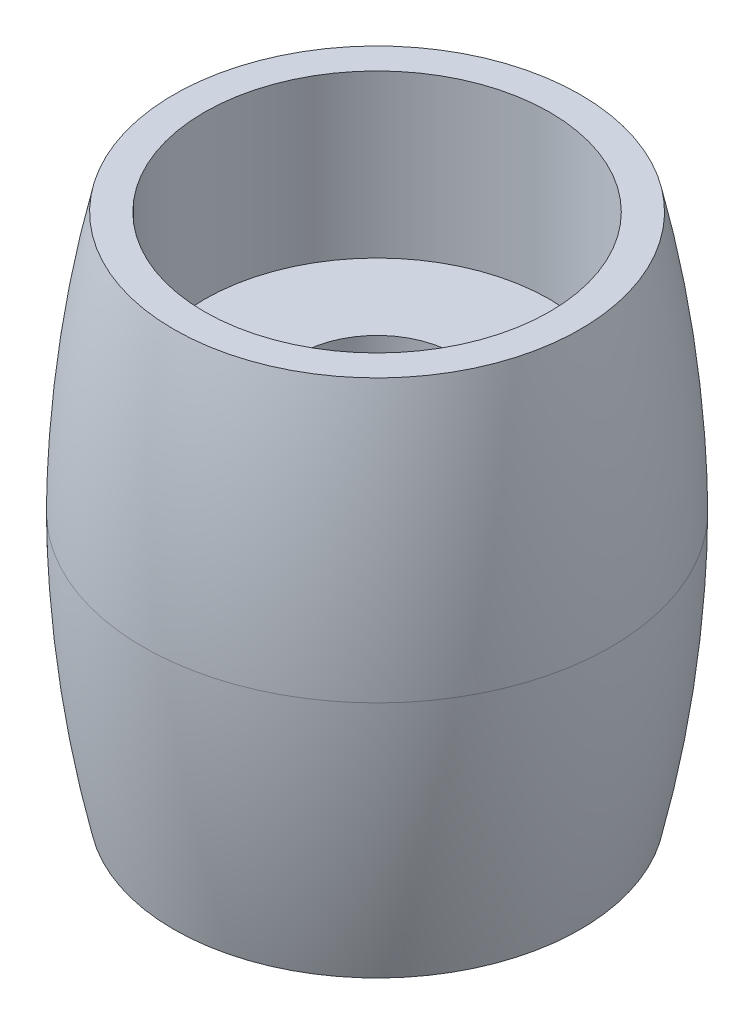
ISO-10303-21;
HEADER;
FILE_DESCRIPTION(('STEP AP214'),'2;1');
FILE_NAME('part.step','',(''),(''),'','','');
FILE_SCHEMA(('AUTOMOTIVE_DESIGN { 1 0 10303 214 1 1 1 1 }'));
ENDSEC;
DATA;
#1=APPLICATION_CONTEXT('core data for automotive mechanical design processes');
#2=APPLICATION_PROTOCOL_DEFINITION('international standard','automotive_design',2000,#1);
#3=PRODUCT_CONTEXT('',#1,'mechanical');
#4=PRODUCT('Part','Part','',(#3));
#5=PRODUCT_RELATED_PRODUCT_CATEGORY('part','',(#4));
#6=PRODUCT_DEFINITION_FORMATION('','',#4);
#7=PRODUCT_DEFINITION_CONTEXT('part definition',#1,'design');
#8=PRODUCT_DEFINITION('design','',#6,#7);
#9=PRODUCT_DEFINITION_SHAPE('','',#8);
#10=(LENGTH_UNIT() NAMED_UNIT(*) SI_UNIT(.MILLI.,.METRE.));
#11=(NAMED_UNIT(*) PLANE_ANGLE_UNIT() SI_UNIT($,.RADIAN.));
#12=(NAMED_UNIT(*) SI_UNIT($,.STERADIAN.) SOLID_ANGLE_UNIT());
#13=UNCERTAINTY_MEASURE_WITH_UNIT(LENGTH_MEASURE(1.E-05),#10,'distance_accuracy_value','');
#14=(GEOMETRIC_REPRESENTATION_CONTEXT(3) GLOBAL_UNCERTAINTY_ASSIGNED_CONTEXT((#13)) GLOBAL_UNIT_ASSIGNED_CONTEXT((#10,
#11,#12)) REPRESENTATION_CONTEXT('',''));
#15=CARTESIAN_POINT('',(0.,0.,0.));
#16=DIRECTION('',(0.,0.,1.));
#17=DIRECTION('',(1.,0.,0.));
#18=AXIS2_PLACEMENT_3D('',#15,#16,#17);
#19=CARTESIAN_POINT('',(0.,-14.5710597404866,0.));
#20=DIRECTION('',(0.,-1.,0.));
#21=DIRECTION('',(0.,0.,-1.));
#22=AXIS2_PLACEMENT_3D('',#19,#20,#21);
#23=CYLINDRICAL_SURFACE('',#22,5.65);
#24=CARTESIAN_POINT('',(0.,-8.5,0.));
#25=DIRECTION('',(0.,-1.,0.));
#26=DIRECTION('',(0.,0.,-1.));
#27=AXIS2_PLACEMENT_3D('',#24,#25,#26);
#28=CIRCLE('',#27,5.65);
#29=CARTESIAN_POINT('',(0.,-8.5,-5.65));
#30=VERTEX_POINT('',#29);
#31=EDGE_CURVE('E53',#30,#30,#28,.T.);
#32=ORIENTED_EDGE('',*,*,#31,.T.);
#33=EDGE_LOOP('',(#32));
#34=FACE_BOUND('',#33,.T.);
#35=CARTESIAN_POINT('',(0.,-3.2,0.));
#36=DIRECTION('',(0.,-1.,0.));
#37=DIRECTION('',(0.,0.,-1.));
#38=AXIS2_PLACEMENT_3D('',#35,#36,#37);
#39=CIRCLE('',#38,5.65);
#40=CARTESIAN_POINT('',(0.,-3.2,-5.65));
#41=VERTEX_POINT('',#40);
#42=EDGE_CURVE('E10',#41,#41,#39,.T.);
#43=ORIENTED_EDGE('',*,*,#42,.F.);
#44=EDGE_LOOP('',(#43));
#45=FACE_BOUND('',#44,.T.);
#46=ADVANCED_FACE('F39',(#34,#45),#23,.F.);
#47=CARTESIAN_POINT('',(5.65,-3.2,0.));
#48=DIRECTION('',(0.,-1.,0.));
#49=DIRECTION('',(0.,0.,-1.));
#50=AXIS2_PLACEMENT_3D('',#47,#48,#49);
#51=PLANE('',#50);
#52=ORIENTED_EDGE('',*,*,#42,.T.);
#53=EDGE_LOOP('',(#52));
#54=FACE_BOUND('',#53,.T.);
#55=CARTESIAN_POINT('',(0.,-3.2,0.));
#56=DIRECTION('',(0.,-1.,0.));
#57=DIRECTION('',(0.,0.,-1.));
#58=AXIS2_PLACEMENT_3D('',#55,#56,#57);
#59=CIRCLE('',#58,2.55);
#60=CARTESIAN_POINT('',(0.,-3.2,-2.55));
#61=VERTEX_POINT('',#60);
#62=EDGE_CURVE('E45',#61,#61,#59,.T.);
#63=ORIENTED_EDGE('',*,*,#62,.F.);
#64=EDGE_LOOP('',(#63));
#65=FACE_BOUND('',#64,.T.);
#66=ADVANCED_FACE('F93',(#54,#65),#51,.T.);
#67=CARTESIAN_POINT('',(0.,-14.5710597404866,0.));
#68=DIRECTION('',(0.,-1.,0.));
#69=DIRECTION('',(0.,0.,-1.));
#70=AXIS2_PLACEMENT_3D('',#67,#68,#69);
#71=CYLINDRICAL_SURFACE('',#70,2.55);
#72=ORIENTED_EDGE('',*,*,#62,.T.);
#73=EDGE_LOOP('',(#72));
#74=FACE_BOUND('',#73,.T.);
#75=CARTESIAN_POINT('',(0.,3.2,0.));
#76=DIRECTION('',(0.,-1.,0.));
#77=DIRECTION('',(0.,0.,-1.));
#78=AXIS2_PLACEMENT_3D('',#75,#76,#77);
#79=CIRCLE('',#78,2.55);
#80=CARTESIAN_POINT('',(0.,3.2,-2.55));
#81=VERTEX_POINT('',#80);
#82=EDGE_CURVE('E61',#81,#81,#79,.T.);
#83=ORIENTED_EDGE('',*,*,#82,.F.);
#84=EDGE_LOOP('',(#83));
#85=FACE_BOUND('',#84,.T.);
#86=ADVANCED_FACE('F90',(#74,#85),#71,.F.);
#87=CARTESIAN_POINT('',(0.,0.396827241567007,0.));
#88=DIRECTION('',(0.,-1.,0.));
#89=DIRECTION('',(0.,0.,-1.));
#90=AXIS2_PLACEMENT_3D('',#87,#88,#89);
#91=DEGENERATE_TOROIDAL_SURFACE('',#90,32.3480315533196,40.,.F.);
#92=CARTESIAN_POINT('',(0.,0.,0.));
#93=DIRECTION('',(0.,-1.,0.));
#94=DIRECTION('',(0.,0.,-1.));
#95=AXIS2_PLACEMENT_3D('',#92,#93,#94);
#96=CIRCLE('',#95,7.65);
#97=CARTESIAN_POINT('',(0.,0.,-7.65));
#98=VERTEX_POINT('',#97);
#99=EDGE_CURVE('E64',#98,#98,#96,.T.);
#100=ORIENTED_EDGE('',*,*,#99,.T.);
#101=EDGE_LOOP('',(#100));
#102=FACE_BOUND('',#101,.T.);
#103=CARTESIAN_POINT('',(0.,-8.5,0.));
#104=DIRECTION('',(0.,-1.,0.));
#105=DIRECTION('',(0.,0.,-1.));
#106=AXIS2_PLACEMENT_3D('',#103,#104,#105);
#107=CIRCLE('',#106,6.65);
#108=CARTESIAN_POINT('',(0.,-8.5,-6.65));
#109=VERTEX_POINT('',#108);
#110=EDGE_CURVE('E49',#109,#109,#107,.T.);
#111=ORIENTED_EDGE('',*,*,#110,.F.);
#112=EDGE_LOOP('',(#111));
#113=FACE_BOUND('',#112,.T.);
#114=ADVANCED_FACE('F92',(#102,#113),#91,.F.);
#115=CARTESIAN_POINT('',(6.65,-8.5,0.));
#116=DIRECTION('',(0.,-1.,0.));
#117=DIRECTION('',(0.,0.,-1.));
#118=AXIS2_PLACEMENT_3D('',#115,#116,#117);
#119=PLANE('',#118);
#120=ORIENTED_EDGE('',*,*,#110,.T.);
#121=EDGE_LOOP('',(#120));
#122=FACE_BOUND('',#121,.T.);
#123=ORIENTED_EDGE('',*,*,#31,.F.);
#124=EDGE_LOOP('',(#123));
#125=FACE_BOUND('',#124,.T.);
#126=ADVANCED_FACE('F80',(#122,#125),#119,.T.);
#127=CARTESIAN_POINT('',(0.,14.5710597404866,0.));
#128=DIRECTION('',(0.,1.,0.));
#129=DIRECTION('',(0.,0.,-1.));
#130=AXIS2_PLACEMENT_3D('',#127,#128,#129);
#131=CYLINDRICAL_SURFACE('',#130,5.65);
#132=CARTESIAN_POINT('',(0.,8.5,0.));
#133=DIRECTION('',(0.,-1.,0.));
#134=DIRECTION('',(0.,0.,-1.));
#135=AXIS2_PLACEMENT_3D('',#132,#133,#134);
#136=CIRCLE('',#135,5.65);
#137=CARTESIAN_POINT('',(0.,8.5,-5.65));
#138=VERTEX_POINT('',#137);
#139=EDGE_CURVE('E70',#138,#138,#136,.T.);
#140=ORIENTED_EDGE('',*,*,#139,.F.);
#141=EDGE_LOOP('',(#140));
#142=FACE_BOUND('',#141,.T.);
#143=CARTESIAN_POINT('',(0.,3.2,0.));
#144=DIRECTION('',(0.,-1.,0.));
#145=DIRECTION('',(0.,0.,-1.));
#146=AXIS2_PLACEMENT_3D('',#143,#144,#145);
#147=CIRCLE('',#146,5.65);
#148=CARTESIAN_POINT('',(0.,3.2,-5.65));
#149=VERTEX_POINT('',#148);
#150=EDGE_CURVE('E58',#149,#149,#147,.T.);
#151=ORIENTED_EDGE('',*,*,#150,.T.);
#152=EDGE_LOOP('',(#151));
#153=FACE_BOUND('',#152,.T.);
#154=ADVANCED_FACE('F76',(#142,#153),#131,.F.);
#155=CARTESIAN_POINT('',(5.65,3.2,0.));
#156=DIRECTION('',(0.,1.,0.));
#157=DIRECTION('',(0.,0.,-1.));
#158=AXIS2_PLACEMENT_3D('',#155,#156,#157);
#159=PLANE('',#158);
#160=ORIENTED_EDGE('',*,*,#150,.F.);
#161=EDGE_LOOP('',(#160));
#162=FACE_BOUND('',#161,.T.);
#163=ORIENTED_EDGE('',*,*,#82,.T.);
#164=EDGE_LOOP('',(#163));
#165=FACE_BOUND('',#164,.T.);
#166=ADVANCED_FACE('F79',(#162,#165),#159,.T.);
#167=CARTESIAN_POINT('',(0.,-0.396827241567007,0.));
#168=DIRECTION('',(0.,1.,0.));
#169=DIRECTION('',(0.,0.,-1.));
#170=AXIS2_PLACEMENT_3D('',#167,#168,#169);
#171=DEGENERATE_TOROIDAL_SURFACE('',#170,32.3480315533196,40.,.F.);
#172=ORIENTED_EDGE('',*,*,#99,.F.);
#173=EDGE_LOOP('',(#172));
#174=FACE_BOUND('',#173,.T.);
#175=CARTESIAN_POINT('',(0.,8.5,0.));
#176=DIRECTION('',(0.,-1.,0.));
#177=DIRECTION('',(0.,0.,-1.));
#178=AXIS2_PLACEMENT_3D('',#175,#176,#177);
#179=CIRCLE('',#178,6.65);
#180=CARTESIAN_POINT('',(0.,8.5,-6.65));
#181=VERTEX_POINT('',#180);
#182=EDGE_CURVE('E67',#181,#181,#179,.T.);
#183=ORIENTED_EDGE('',*,*,#182,.T.);
#184=EDGE_LOOP('',(#183));
#185=FACE_BOUND('',#184,.T.);
#186=ADVANCED_FACE('F86',(#174,#185),#171,.F.);
#187=CARTESIAN_POINT('',(6.65,8.5,0.));
#188=DIRECTION('',(0.,1.,0.));
#189=DIRECTION('',(0.,0.,-1.));
#190=AXIS2_PLACEMENT_3D('',#187,#188,#189);
#191=PLANE('',#190);
#192=ORIENTED_EDGE('',*,*,#182,.F.);
#193=EDGE_LOOP('',(#192));
#194=FACE_BOUND('',#193,.T.);
#195=ORIENTED_EDGE('',*,*,#139,.T.);
#196=EDGE_LOOP('',(#195));
#197=FACE_BOUND('',#196,.T.);
#198=ADVANCED_FACE('F74',(#194,#197),#191,.T.);
#199=CLOSED_SHELL('',(#46,#66,#86,#114,#126,#154,#166,#186,#198));
#200=MANIFOLD_SOLID_BREP('B2',#199);
#201=ADVANCED_BREP_SHAPE_REPRESENTATION('',(#18,#200),#14);
#202=SHAPE_DEFINITION_REPRESENTATION(#9,#201);
ENDSEC;
END-ISO-10303-21;
